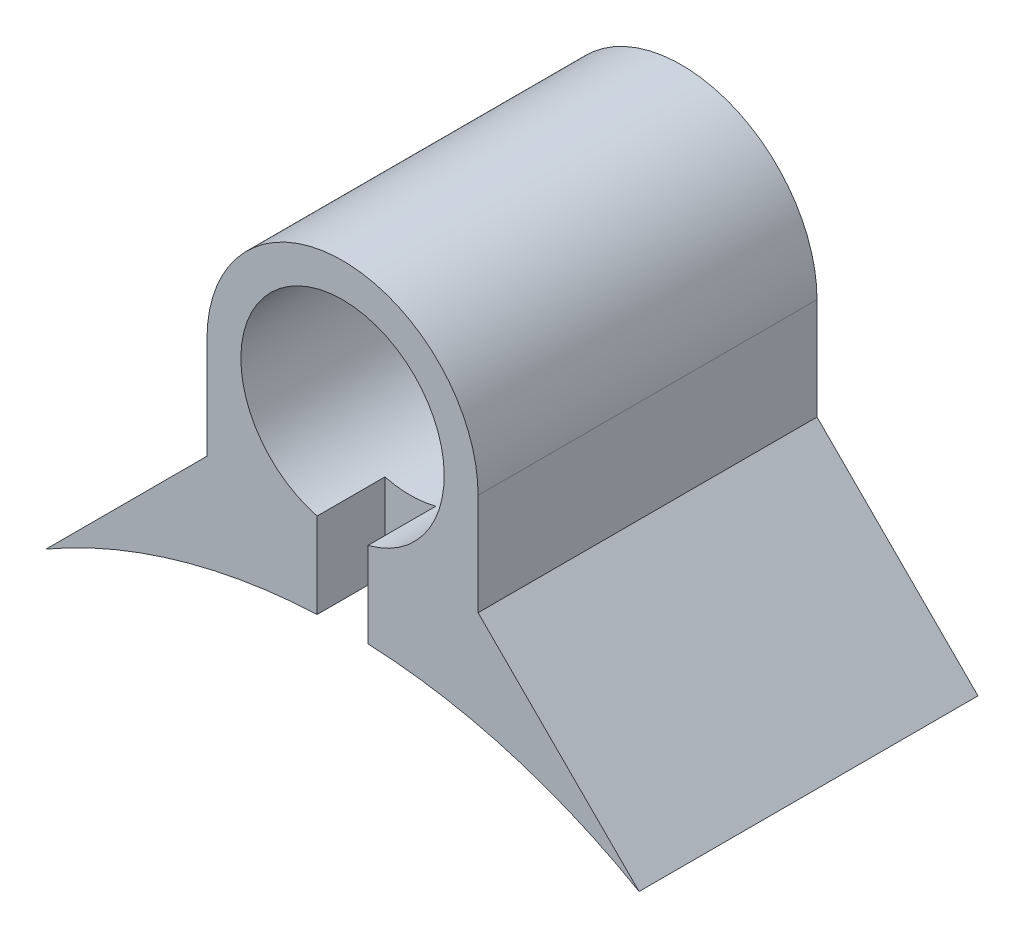
ISO-10303-21;
HEADER;
FILE_DESCRIPTION(('STEP AP214'),'2;1');
FILE_NAME('part.step','',(''),(''),'','','');
FILE_SCHEMA(('AUTOMOTIVE_DESIGN { 1 0 10303 214 1 1 1 1 }'));
ENDSEC;
DATA;
#1=APPLICATION_CONTEXT('core data for automotive mechanical design processes');
#2=APPLICATION_PROTOCOL_DEFINITION('international standard','automotive_design',2000,#1);
#3=PRODUCT_CONTEXT('',#1,'mechanical');
#4=PRODUCT('Part','Part','',(#3));
#5=PRODUCT_RELATED_PRODUCT_CATEGORY('part','',(#4));
#6=PRODUCT_DEFINITION_FORMATION('','',#4);
#7=PRODUCT_DEFINITION_CONTEXT('part definition',#1,'design');
#8=PRODUCT_DEFINITION('design','',#6,#7);
#9=PRODUCT_DEFINITION_SHAPE('','',#8);
#10=(LENGTH_UNIT() NAMED_UNIT(*) SI_UNIT(.MILLI.,.METRE.));
#11=(NAMED_UNIT(*) PLANE_ANGLE_UNIT() SI_UNIT($,.RADIAN.));
#12=(NAMED_UNIT(*) SI_UNIT($,.STERADIAN.) SOLID_ANGLE_UNIT());
#13=UNCERTAINTY_MEASURE_WITH_UNIT(LENGTH_MEASURE(1.E-05),#10,'distance_accuracy_value','');
#14=(GEOMETRIC_REPRESENTATION_CONTEXT(3) GLOBAL_UNCERTAINTY_ASSIGNED_CONTEXT((#13)) GLOBAL_UNIT_ASSIGNED_CONTEXT((#10,
#11,#12)) REPRESENTATION_CONTEXT('',''));
#15=CARTESIAN_POINT('',(0.,0.,0.));
#16=DIRECTION('',(0.,0.,1.));
#17=DIRECTION('',(1.,0.,0.));
#18=AXIS2_PLACEMENT_3D('',#15,#16,#17);
#19=CARTESIAN_POINT('',(-11.9527222831138,11.9527222831138,10.));
#20=DIRECTION('',(-0.707106781186547,0.707106781186548,0.));
#21=DIRECTION('',(-0.707106781186548,-0.707106781186547,0.));
#22=AXIS2_PLACEMENT_3D('',#19,#20,#21);
#23=PLANE('',#22);
#24=DIRECTION('',(0.707106781186548,0.707106781186547,0.));
#25=VECTOR('',#24,1.);
#26=CARTESIAN_POINT('',(-11.9527222831138,11.9527222831138,0.));
#27=LINE('',#26,#25);
#28=CARTESIAN_POINT('',(-8.74999999999991,15.1554445662277,0.));
#29=VERTEX_POINT('',#28);
#30=CARTESIAN_POINT('',(-4.,19.9054445662276,0.));
#31=VERTEX_POINT('',#30);
#32=EDGE_CURVE('E148',#29,#31,#27,.T.);
#33=ORIENTED_EDGE('',*,*,#32,.F.);
#34=DIRECTION('',(0.,0.,-1.));
#35=VECTOR('',#34,1.);
#36=CARTESIAN_POINT('',(-8.74999999999991,15.1554445662277,10.));
#37=LINE('',#36,#35);
#38=CARTESIAN_POINT('',(-8.74999999999991,15.1554445662277,10.));
#39=VERTEX_POINT('',#38);
#40=EDGE_CURVE('E11',#39,#29,#37,.T.);
#41=ORIENTED_EDGE('',*,*,#40,.F.);
#42=DIRECTION('',(0.707106781186548,0.707106781186547,0.));
#43=VECTOR('',#42,1.);
#44=CARTESIAN_POINT('',(-11.9527222831138,11.9527222831138,10.));
#45=LINE('',#44,#43);
#46=CARTESIAN_POINT('',(-4.,19.9054445662276,10.));
#47=VERTEX_POINT('',#46);
#48=EDGE_CURVE('E254',#39,#47,#45,.T.);
#49=ORIENTED_EDGE('',*,*,#48,.T.);
#50=DIRECTION('',(0.,0.,-1.));
#51=VECTOR('',#50,1.);
#52=CARTESIAN_POINT('',(-4.,19.9054445662276,10.));
#53=LINE('',#52,#51);
#54=EDGE_CURVE('E92',#47,#31,#53,.T.);
#55=ORIENTED_EDGE('',*,*,#54,.T.);
#56=EDGE_LOOP('',(#33,#41,#49,#55));
#57=FACE_BOUND('',#56,.T.);
#58=ADVANCED_FACE('F41',(#57),#23,.T.);
#59=CARTESIAN_POINT('',(0.,0.,10.));
#60=DIRECTION('',(0.,0.,-1.));
#61=DIRECTION('',(-1.,0.,0.));
#62=AXIS2_PLACEMENT_3D('',#59,#60,#61);
#63=CYLINDRICAL_SURFACE('',#62,17.5);
#64=CARTESIAN_POINT('',(0.,0.,10.));
#65=DIRECTION('',(0.,0.,1.));
#66=DIRECTION('',(1.,0.,0.));
#67=AXIS2_PLACEMENT_3D('',#64,#65,#66);
#68=CIRCLE('',#67,17.5);
#69=CARTESIAN_POINT('',(0.749999999999998,17.4839211849059,10.));
#70=VERTEX_POINT('',#69);
#71=CARTESIAN_POINT('',(8.74999999999991,15.1554445662277,10.));
#72=VERTEX_POINT('',#71);
#73=EDGE_CURVE('E256',#70,#72,#68,.F.);
#74=ORIENTED_EDGE('',*,*,#73,.F.);
#75=DIRECTION('',(0.,0.,1.));
#76=VECTOR('',#75,1.);
#77=CARTESIAN_POINT('',(0.749999999999998,17.4839211849059,8.));
#78=LINE('',#77,#76);
#79=CARTESIAN_POINT('',(0.749999999999998,17.4839211849059,8.));
#80=VERTEX_POINT('',#79);
#81=EDGE_CURVE('E246',#80,#70,#78,.T.);
#82=ORIENTED_EDGE('',*,*,#81,.F.);
#83=CARTESIAN_POINT('',(0.,0.,8.));
#84=DIRECTION('',(0.,0.,1.));
#85=DIRECTION('',(1.,0.,0.));
#86=AXIS2_PLACEMENT_3D('',#83,#84,#85);
#87=CIRCLE('',#86,17.5);
#88=CARTESIAN_POINT('',(-0.749999999999995,17.4839211849059,8.));
#89=VERTEX_POINT('',#88);
#90=EDGE_CURVE('E248',#89,#80,#87,.F.);
#91=ORIENTED_EDGE('',*,*,#90,.F.);
#92=DIRECTION('',(0.,0.,1.));
#93=VECTOR('',#92,1.);
#94=CARTESIAN_POINT('',(-0.749999999999995,17.4839211849059,8.));
#95=LINE('',#94,#93);
#96=CARTESIAN_POINT('',(-0.749999999999995,17.4839211849059,10.));
#97=VERTEX_POINT('',#96);
#98=EDGE_CURVE('E241',#89,#97,#95,.T.);
#99=ORIENTED_EDGE('',*,*,#98,.T.);
#100=EDGE_CURVE('E138',#39,#97,#68,.F.);
#101=ORIENTED_EDGE('',*,*,#100,.F.);
#102=ORIENTED_EDGE('',*,*,#40,.T.);
#103=CARTESIAN_POINT('',(0.,0.,0.));
#104=DIRECTION('',(0.,0.,1.));
#105=DIRECTION('',(1.,0.,0.));
#106=AXIS2_PLACEMENT_3D('',#103,#104,#105);
#107=CIRCLE('',#106,17.5);
#108=CARTESIAN_POINT('',(8.74999999999991,15.1554445662277,0.));
#109=VERTEX_POINT('',#108);
#110=EDGE_CURVE('E153',#29,#109,#107,.F.);
#111=ORIENTED_EDGE('',*,*,#110,.T.);
#112=DIRECTION('',(0.,0.,-1.));
#113=VECTOR('',#112,1.);
#114=CARTESIAN_POINT('',(8.74999999999991,15.1554445662277,10.));
#115=LINE('',#114,#113);
#116=EDGE_CURVE('E50',#72,#109,#115,.T.);
#117=ORIENTED_EDGE('',*,*,#116,.F.);
#118=EDGE_LOOP('',(#74,#82,#91,#99,#101,#102,#111,#117));
#119=FACE_BOUND('',#118,.T.);
#120=ADVANCED_FACE('F183',(#119),#63,.F.);
#121=CARTESIAN_POINT('',(11.9527222831138,11.9527222831138,10.));
#122=DIRECTION('',(-0.707106781186547,-0.707106781186548,0.));
#123=DIRECTION('',(0.707106781186548,-0.707106781186547,0.));
#124=AXIS2_PLACEMENT_3D('',#121,#122,#123);
#125=PLANE('',#124);
#126=DIRECTION('',(-0.707106781186548,0.707106781186547,0.));
#127=VECTOR('',#126,1.);
#128=CARTESIAN_POINT('',(11.9527222831138,11.9527222831138,0.));
#129=LINE('',#128,#127);
#130=CARTESIAN_POINT('',(4.,19.9054445662276,0.));
#131=VERTEX_POINT('',#130);
#132=EDGE_CURVE('E157',#109,#131,#129,.T.);
#133=ORIENTED_EDGE('',*,*,#132,.T.);
#134=DIRECTION('',(0.,0.,-1.));
#135=VECTOR('',#134,1.);
#136=CARTESIAN_POINT('',(4.,19.9054445662276,10.));
#137=LINE('',#136,#135);
#138=CARTESIAN_POINT('',(4.,19.9054445662276,10.));
#139=VERTEX_POINT('',#138);
#140=EDGE_CURVE('E121',#139,#131,#137,.T.);
#141=ORIENTED_EDGE('',*,*,#140,.F.);
#142=DIRECTION('',(-0.707106781186548,0.707106781186547,0.));
#143=VECTOR('',#142,1.);
#144=CARTESIAN_POINT('',(11.9527222831138,11.9527222831138,10.));
#145=LINE('',#144,#143);
#146=EDGE_CURVE('E133',#72,#139,#145,.T.);
#147=ORIENTED_EDGE('',*,*,#146,.F.);
#148=ORIENTED_EDGE('',*,*,#116,.T.);
#149=EDGE_LOOP('',(#133,#141,#147,#148));
#150=FACE_BOUND('',#149,.T.);
#151=ADVANCED_FACE('F179',(#150),#125,.F.);
#152=CARTESIAN_POINT('',(4.,0.,10.));
#153=DIRECTION('',(1.,0.,0.));
#154=DIRECTION('',(0.,0.,-1.));
#155=AXIS2_PLACEMENT_3D('',#152,#153,#154);
#156=PLANE('',#155);
#157=DIRECTION('',(0.,-1.,0.));
#158=VECTOR('',#157,1.);
#159=CARTESIAN_POINT('',(4.,0.,0.));
#160=LINE('',#159,#158);
#161=CARTESIAN_POINT('',(4.,22.9054445662276,0.));
#162=VERTEX_POINT('',#161);
#163=EDGE_CURVE('E116',#162,#131,#160,.T.);
#164=ORIENTED_EDGE('',*,*,#163,.F.);
#165=DIRECTION('',(0.,0.,-1.));
#166=VECTOR('',#165,1.);
#167=CARTESIAN_POINT('',(4.,22.9054445662276,10.));
#168=LINE('',#167,#166);
#169=CARTESIAN_POINT('',(4.,22.9054445662276,10.));
#170=VERTEX_POINT('',#169);
#171=EDGE_CURVE('E110',#170,#162,#168,.T.);
#172=ORIENTED_EDGE('',*,*,#171,.F.);
#173=DIRECTION('',(0.,-1.,0.));
#174=VECTOR('',#173,1.);
#175=CARTESIAN_POINT('',(4.,0.,10.));
#176=LINE('',#175,#174);
#177=EDGE_CURVE('E114',#170,#139,#176,.T.);
#178=ORIENTED_EDGE('',*,*,#177,.T.);
#179=ORIENTED_EDGE('',*,*,#140,.T.);
#180=EDGE_LOOP('',(#164,#172,#178,#179));
#181=FACE_BOUND('',#180,.T.);
#182=ADVANCED_FACE('F112',(#181),#156,.T.);
#183=CARTESIAN_POINT('',(0.,22.9054445662276,10.));
#184=DIRECTION('',(0.,0.,-1.));
#185=DIRECTION('',(-1.,0.,0.));
#186=AXIS2_PLACEMENT_3D('',#183,#184,#185);
#187=CYLINDRICAL_SURFACE('',#186,4.);
#188=CARTESIAN_POINT('',(0.,22.9054445662276,0.));
#189=DIRECTION('',(0.,0.,1.));
#190=DIRECTION('',(1.,0.,0.));
#191=AXIS2_PLACEMENT_3D('',#188,#189,#190);
#192=CIRCLE('',#191,4.);
#193=CARTESIAN_POINT('',(-4.,22.9054445662276,0.));
#194=VERTEX_POINT('',#193);
#195=EDGE_CURVE('E163',#162,#194,#192,.T.);
#196=ORIENTED_EDGE('',*,*,#195,.T.);
#197=DIRECTION('',(0.,0.,-1.));
#198=VECTOR('',#197,1.);
#199=CARTESIAN_POINT('',(-4.,22.9054445662276,10.));
#200=LINE('',#199,#198);
#201=CARTESIAN_POINT('',(-4.,22.9054445662276,10.));
#202=VERTEX_POINT('',#201);
#203=EDGE_CURVE('E122',#202,#194,#200,.T.);
#204=ORIENTED_EDGE('',*,*,#203,.F.);
#205=CARTESIAN_POINT('',(0.,22.9054445662276,10.));
#206=DIRECTION('',(0.,0.,1.));
#207=DIRECTION('',(1.,0.,0.));
#208=AXIS2_PLACEMENT_3D('',#205,#206,#207);
#209=CIRCLE('',#208,4.);
#210=EDGE_CURVE('E125',#170,#202,#209,.T.);
#211=ORIENTED_EDGE('',*,*,#210,.F.);
#212=ORIENTED_EDGE('',*,*,#171,.T.);
#213=EDGE_LOOP('',(#196,#204,#211,#212));
#214=FACE_BOUND('',#213,.T.);
#215=ADVANCED_FACE('F126',(#214),#187,.T.);
#216=CARTESIAN_POINT('',(0.,22.9054445662276,10.));
#217=DIRECTION('',(0.,0.,-1.));
#218=DIRECTION('',(-1.,0.,0.));
#219=AXIS2_PLACEMENT_3D('',#216,#217,#218);
#220=CYLINDRICAL_SURFACE('',#219,3.);
#221=DIRECTION('',(0.,0.,1.));
#222=VECTOR('',#221,1.);
#223=CARTESIAN_POINT('',(0.750000000000004,20.0007070565721,8.));
#224=LINE('',#223,#222);
#225=CARTESIAN_POINT('',(0.750000000000004,20.0007070565721,8.));
#226=VERTEX_POINT('',#225);
#227=CARTESIAN_POINT('',(0.750000000000004,20.0007070565721,10.));
#228=VERTEX_POINT('',#227);
#229=EDGE_CURVE('E149',#226,#228,#224,.T.);
#230=ORIENTED_EDGE('',*,*,#229,.T.);
#231=CARTESIAN_POINT('',(0.,22.9054445662276,10.));
#232=DIRECTION('',(0.,0.,1.));
#233=DIRECTION('',(1.,0.,0.));
#234=AXIS2_PLACEMENT_3D('',#231,#232,#233);
#235=CIRCLE('',#234,3.);
#236=CARTESIAN_POINT('',(-0.750000000000002,20.0007070565721,10.));
#237=VERTEX_POINT('',#236);
#238=EDGE_CURVE('E169',#228,#237,#235,.T.);
#239=ORIENTED_EDGE('',*,*,#238,.T.);
#240=DIRECTION('',(0.,0.,1.));
#241=VECTOR('',#240,1.);
#242=CARTESIAN_POINT('',(-0.750000000000002,20.0007070565721,8.));
#243=LINE('',#242,#241);
#244=CARTESIAN_POINT('',(-0.750000000000002,20.0007070565721,8.));
#245=VERTEX_POINT('',#244);
#246=EDGE_CURVE('E57',#245,#237,#243,.T.);
#247=ORIENTED_EDGE('',*,*,#246,.F.);
#248=CARTESIAN_POINT('',(0.,22.9054445662276,8.));
#249=DIRECTION('',(0.,0.,1.));
#250=DIRECTION('',(1.,0.,0.));
#251=AXIS2_PLACEMENT_3D('',#248,#249,#250);
#252=CIRCLE('',#251,3.);
#253=EDGE_CURVE('E224',#226,#245,#252,.F.);
#254=ORIENTED_EDGE('',*,*,#253,.F.);
#255=EDGE_LOOP('',(#230,#239,#247,#254));
#256=FACE_BOUND('',#255,.T.);
#257=CARTESIAN_POINT('',(0.,22.9054445662276,0.));
#258=DIRECTION('',(0.,0.,1.));
#259=DIRECTION('',(1.,0.,0.));
#260=AXIS2_PLACEMENT_3D('',#257,#258,#259);
#261=CIRCLE('',#260,3.);
#262=CARTESIAN_POINT('',(3.,22.9054445662276,0.));
#263=VERTEX_POINT('',#262);
#264=EDGE_CURVE('E144',#263,#263,#261,.T.);
#265=ORIENTED_EDGE('',*,*,#264,.F.);
#266=EDGE_LOOP('',(#265));
#267=FACE_BOUND('',#266,.T.);
#268=ADVANCED_FACE('F43',(#256,#267),#220,.F.);
#269=CARTESIAN_POINT('',(-4.,0.,10.));
#270=DIRECTION('',(1.,0.,0.));
#271=DIRECTION('',(0.,0.,-1.));
#272=AXIS2_PLACEMENT_3D('',#269,#270,#271);
#273=PLANE('',#272);
#274=DIRECTION('',(0.,-1.,0.));
#275=VECTOR('',#274,1.);
#276=CARTESIAN_POINT('',(-4.,0.,0.));
#277=LINE('',#276,#275);
#278=EDGE_CURVE('E166',#194,#31,#277,.T.);
#279=ORIENTED_EDGE('',*,*,#278,.T.);
#280=ORIENTED_EDGE('',*,*,#54,.F.);
#281=DIRECTION('',(0.,-1.,0.));
#282=VECTOR('',#281,1.);
#283=CARTESIAN_POINT('',(-4.,0.,10.));
#284=LINE('',#283,#282);
#285=EDGE_CURVE('E66',#202,#47,#284,.T.);
#286=ORIENTED_EDGE('',*,*,#285,.F.);
#287=ORIENTED_EDGE('',*,*,#203,.T.);
#288=EDGE_LOOP('',(#279,#280,#286,#287));
#289=FACE_BOUND('',#288,.T.);
#290=ADVANCED_FACE('F198',(#289),#273,.F.);
#291=CARTESIAN_POINT('',(0.,0.,10.));
#292=DIRECTION('',(0.,0.,1.));
#293=DIRECTION('',(1.,0.,0.));
#294=AXIS2_PLACEMENT_3D('',#291,#292,#293);
#295=PLANE('',#294);
#296=DIRECTION('',(0.,1.,0.));
#297=VECTOR('',#296,1.);
#298=CARTESIAN_POINT('',(0.749999999999899,0.,10.));
#299=LINE('',#298,#297);
#300=EDGE_CURVE('E235',#70,#228,#299,.T.);
#301=ORIENTED_EDGE('',*,*,#300,.F.);
#302=ORIENTED_EDGE('',*,*,#73,.T.);
#303=ORIENTED_EDGE('',*,*,#146,.T.);
#304=ORIENTED_EDGE('',*,*,#177,.F.);
#305=ORIENTED_EDGE('',*,*,#210,.T.);
#306=ORIENTED_EDGE('',*,*,#285,.T.);
#307=ORIENTED_EDGE('',*,*,#48,.F.);
#308=ORIENTED_EDGE('',*,*,#100,.T.);
#309=DIRECTION('',(0.,1.,0.));
#310=VECTOR('',#309,1.);
#311=CARTESIAN_POINT('',(-0.750000000000002,0.,10.));
#312=LINE('',#311,#310);
#313=EDGE_CURVE('E272',#97,#237,#312,.T.);
#314=ORIENTED_EDGE('',*,*,#313,.T.);
#315=ORIENTED_EDGE('',*,*,#238,.F.);
#316=EDGE_LOOP('',(#301,#302,#303,#304,#305,#306,#307,#308,#314,#315));
#317=FACE_BOUND('',#316,.T.);
#318=ADVANCED_FACE('F131',(#317),#295,.T.);
#319=CARTESIAN_POINT('',(0.,0.,0.));
#320=DIRECTION('',(0.,0.,1.));
#321=DIRECTION('',(1.,0.,0.));
#322=AXIS2_PLACEMENT_3D('',#319,#320,#321);
#323=PLANE('',#322);
#324=ORIENTED_EDGE('',*,*,#264,.T.);
#325=EDGE_LOOP('',(#324));
#326=FACE_BOUND('',#325,.T.);
#327=ORIENTED_EDGE('',*,*,#32,.T.);
#328=ORIENTED_EDGE('',*,*,#278,.F.);
#329=ORIENTED_EDGE('',*,*,#195,.F.);
#330=ORIENTED_EDGE('',*,*,#163,.T.);
#331=ORIENTED_EDGE('',*,*,#132,.F.);
#332=ORIENTED_EDGE('',*,*,#110,.F.);
#333=EDGE_LOOP('',(#327,#328,#329,#330,#331,#332));
#334=FACE_BOUND('',#333,.T.);
#335=ADVANCED_FACE('F185',(#326,#334),#323,.F.);
#336=CARTESIAN_POINT('',(0.749999999999899,0.,8.));
#337=DIRECTION('',(1.,0.,0.));
#338=DIRECTION('',(0.,1.,0.));
#339=AXIS2_PLACEMENT_3D('',#336,#337,#338);
#340=PLANE('',#339);
#341=ORIENTED_EDGE('',*,*,#300,.T.);
#342=ORIENTED_EDGE('',*,*,#229,.F.);
#343=DIRECTION('',(0.,1.,0.));
#344=VECTOR('',#343,1.);
#345=CARTESIAN_POINT('',(0.749999999999899,0.,8.));
#346=LINE('',#345,#344);
#347=EDGE_CURVE('E230',#80,#226,#346,.T.);
#348=ORIENTED_EDGE('',*,*,#347,.F.);
#349=ORIENTED_EDGE('',*,*,#81,.T.);
#350=EDGE_LOOP('',(#341,#342,#348,#349));
#351=FACE_BOUND('',#350,.T.);
#352=ADVANCED_FACE('F204',(#351),#340,.F.);
#353=CARTESIAN_POINT('',(-0.750000000000002,0.,8.));
#354=DIRECTION('',(1.,0.,0.));
#355=DIRECTION('',(0.,0.,-1.));
#356=AXIS2_PLACEMENT_3D('',#353,#354,#355);
#357=PLANE('',#356);
#358=ORIENTED_EDGE('',*,*,#313,.F.);
#359=ORIENTED_EDGE('',*,*,#98,.F.);
#360=DIRECTION('',(0.,1.,0.));
#361=VECTOR('',#360,1.);
#362=CARTESIAN_POINT('',(-0.750000000000002,0.,8.));
#363=LINE('',#362,#361);
#364=EDGE_CURVE('E227',#89,#245,#363,.T.);
#365=ORIENTED_EDGE('',*,*,#364,.T.);
#366=ORIENTED_EDGE('',*,*,#246,.T.);
#367=EDGE_LOOP('',(#358,#359,#365,#366));
#368=FACE_BOUND('',#367,.T.);
#369=ADVANCED_FACE('F208',(#368),#357,.T.);
#370=CARTESIAN_POINT('',(0.,0.,8.));
#371=DIRECTION('',(0.,0.,1.));
#372=DIRECTION('',(1.,0.,0.));
#373=AXIS2_PLACEMENT_3D('',#370,#371,#372);
#374=PLANE('',#373);
#375=ORIENTED_EDGE('',*,*,#253,.T.);
#376=ORIENTED_EDGE('',*,*,#364,.F.);
#377=ORIENTED_EDGE('',*,*,#90,.T.);
#378=ORIENTED_EDGE('',*,*,#347,.T.);
#379=EDGE_LOOP('',(#375,#376,#377,#378));
#380=FACE_BOUND('',#379,.T.);
#381=ADVANCED_FACE('F211',(#380),#374,.T.);
#382=CLOSED_SHELL('',(#58,#120,#151,#182,#215,#268,#290,#318,#335,#352,#369,#381));
#383=MANIFOLD_SOLID_BREP('B2',#382);
#384=ADVANCED_BREP_SHAPE_REPRESENTATION('',(#18,#383),#14);
#385=SHAPE_DEFINITION_REPRESENTATION(#9,#384);
ENDSEC;
END-ISO-10303-21;
